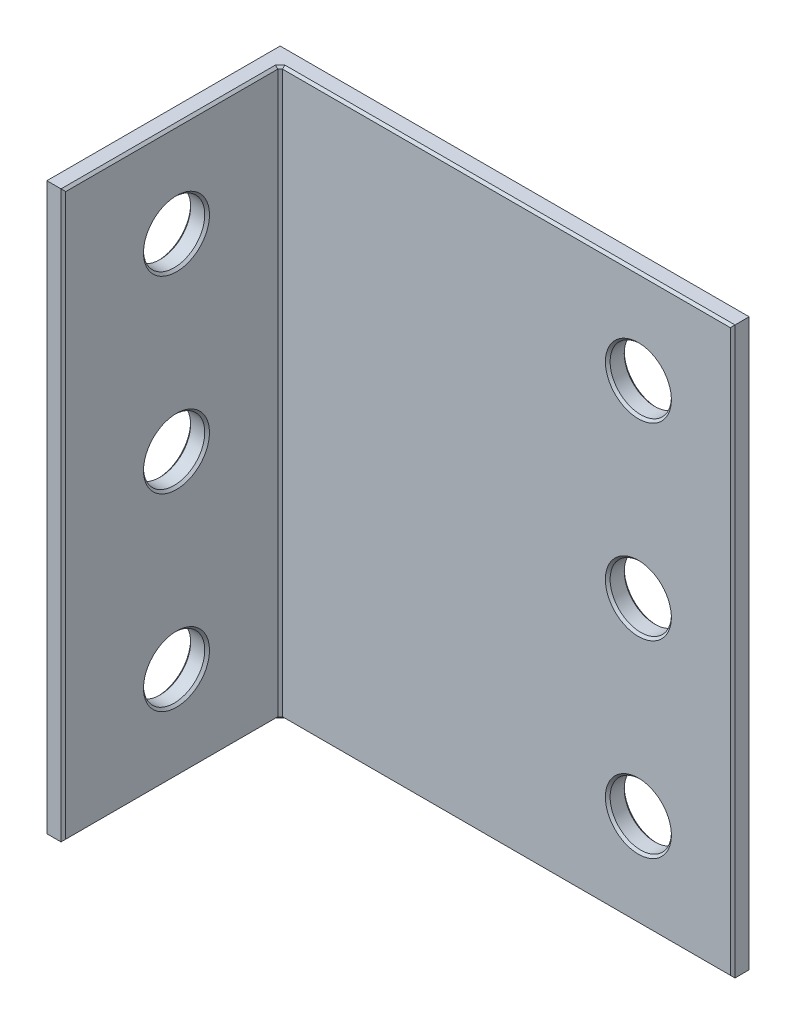
ISO-10303-21;
HEADER;
FILE_DESCRIPTION(('STEP AP214'),'2;1');
FILE_NAME('part.step','',(''),(''),'','','');
FILE_SCHEMA(('AUTOMOTIVE_DESIGN { 1 0 10303 214 1 1 1 1 }'));
ENDSEC;
DATA;
#1=APPLICATION_CONTEXT('core data for automotive mechanical design processes');
#2=APPLICATION_PROTOCOL_DEFINITION('international standard','automotive_design',2000,#1);
#3=PRODUCT_CONTEXT('',#1,'mechanical');
#4=PRODUCT('Part','Part','',(#3));
#5=PRODUCT_RELATED_PRODUCT_CATEGORY('part','',(#4));
#6=PRODUCT_DEFINITION_FORMATION('','',#4);
#7=PRODUCT_DEFINITION_CONTEXT('part definition',#1,'design');
#8=PRODUCT_DEFINITION('design','',#6,#7);
#9=PRODUCT_DEFINITION_SHAPE('','',#8);
#10=(LENGTH_UNIT() NAMED_UNIT(*) SI_UNIT(.MILLI.,.METRE.));
#11=(NAMED_UNIT(*) PLANE_ANGLE_UNIT() SI_UNIT($,.RADIAN.));
#12=(NAMED_UNIT(*) SI_UNIT($,.STERADIAN.) SOLID_ANGLE_UNIT());
#13=UNCERTAINTY_MEASURE_WITH_UNIT(LENGTH_MEASURE(1.E-05),#10,'distance_accuracy_value','');
#14=(GEOMETRIC_REPRESENTATION_CONTEXT(3) GLOBAL_UNCERTAINTY_ASSIGNED_CONTEXT((#13)) GLOBAL_UNIT_ASSIGNED_CONTEXT((#10,
#11,#12)) REPRESENTATION_CONTEXT('',''));
#15=CARTESIAN_POINT('',(0.,0.,0.));
#16=DIRECTION('',(0.,0.,1.));
#17=DIRECTION('',(1.,0.,0.));
#18=AXIS2_PLACEMENT_3D('',#15,#16,#17);
#19=CARTESIAN_POINT('',(0.,0.,8.));
#20=DIRECTION('',(0.,1.,0.));
#21=DIRECTION('',(0.,0.,1.));
#22=AXIS2_PLACEMENT_3D('',#19,#20,#21);
#23=PLANE('',#22);
#24=DIRECTION('',(0.,0.,-1.));
#25=VECTOR('',#24,1.);
#26=CARTESIAN_POINT('',(1.,0.,8.));
#27=LINE('',#26,#25);
#28=CARTESIAN_POINT('',(1.,0.,100.));
#29=VERTEX_POINT('',#28);
#30=CARTESIAN_POINT('',(1.,0.,1.));
#31=VERTEX_POINT('',#30);
#32=EDGE_CURVE('E333',#29,#31,#27,.T.);
#33=ORIENTED_EDGE('',*,*,#32,.T.);
#34=DIRECTION('',(1.,0.,0.));
#35=VECTOR('',#34,1.);
#36=CARTESIAN_POINT('',(200.,0.,1.));
#37=LINE('',#36,#35);
#38=CARTESIAN_POINT('',(200.,0.,1.));
#39=VERTEX_POINT('',#38);
#40=EDGE_CURVE('E335',#31,#39,#37,.T.);
#41=ORIENTED_EDGE('',*,*,#40,.T.);
#42=DIRECTION('',(0.,0.,-1.));
#43=VECTOR('',#42,1.);
#44=CARTESIAN_POINT('',(200.,0.,8.));
#45=LINE('',#44,#43);
#46=CARTESIAN_POINT('',(200.,0.,6.99999999999999));
#47=VERTEX_POINT('',#46);
#48=EDGE_CURVE('E346',#47,#39,#45,.T.);
#49=ORIENTED_EDGE('',*,*,#48,.F.);
#50=DIRECTION('',(-1.,0.,0.));
#51=VECTOR('',#50,1.);
#52=CARTESIAN_POINT('',(0.,0.,6.99999999999999));
#53=LINE('',#52,#51);
#54=CARTESIAN_POINT('',(9.00000000000002,0.,6.99999999999999));
#55=VERTEX_POINT('',#54);
#56=EDGE_CURVE('E331',#47,#55,#53,.T.);
#57=ORIENTED_EDGE('',*,*,#56,.T.);
#58=DIRECTION('',(0.707106781186544,0.,-0.707106781186551));
#59=VECTOR('',#58,1.);
#60=CARTESIAN_POINT('',(9.00000000000002,0.,6.99999999999999));
#61=LINE('',#60,#59);
#62=CARTESIAN_POINT('',(8.00000000000001,0.,8.));
#63=VERTEX_POINT('',#62);
#64=EDGE_CURVE('E329',#63,#55,#61,.T.);
#65=ORIENTED_EDGE('',*,*,#64,.F.);
#66=DIRECTION('',(0.707106781186544,0.,-0.707106781186551));
#67=VECTOR('',#66,1.);
#68=CARTESIAN_POINT('',(9.00000000000002,0.,6.99999999999999));
#69=LINE('',#68,#67);
#70=CARTESIAN_POINT('',(7.00000000000003,0.,9.00000000000001));
#71=VERTEX_POINT('',#70);
#72=EDGE_CURVE('E286',#71,#63,#69,.T.);
#73=ORIENTED_EDGE('',*,*,#72,.F.);
#74=DIRECTION('',(0.,0.,1.));
#75=VECTOR('',#74,1.);
#76=CARTESIAN_POINT('',(7.00000000000003,0.,8.));
#77=LINE('',#76,#75);
#78=CARTESIAN_POINT('',(7.00000000000003,0.,100.));
#79=VERTEX_POINT('',#78);
#80=EDGE_CURVE('E291',#71,#79,#77,.T.);
#81=ORIENTED_EDGE('',*,*,#80,.T.);
#82=DIRECTION('',(1.,0.,0.));
#83=VECTOR('',#82,1.);
#84=CARTESIAN_POINT('',(0.,0.,100.));
#85=LINE('',#84,#83);
#86=EDGE_CURVE('E255',#29,#79,#85,.T.);
#87=ORIENTED_EDGE('',*,*,#86,.F.);
#88=EDGE_LOOP('',(#33,#41,#49,#57,#65,#73,#81,#87));
#89=FACE_BOUND('',#88,.T.);
#90=ADVANCED_FACE('F34',(#89),#23,.F.);
#91=CARTESIAN_POINT('',(0.,240.,8.));
#92=DIRECTION('',(0.,0.,-1.));
#93=DIRECTION('',(-1.,0.,0.));
#94=AXIS2_PLACEMENT_3D('',#91,#92,#93);
#95=PLANE('',#94);
#96=CARTESIAN_POINT('',(160.,40.,8.));
#97=DIRECTION('',(0.,0.,-1.));
#98=DIRECTION('',(-1.,0.,0.));
#99=AXIS2_PLACEMENT_3D('',#96,#97,#98);
#100=CIRCLE('',#99,14.);
#101=CARTESIAN_POINT('',(146.,40.,8.));
#102=VERTEX_POINT('',#101);
#103=EDGE_CURVE('E324',#102,#102,#100,.T.);
#104=ORIENTED_EDGE('',*,*,#103,.T.);
#105=EDGE_LOOP('',(#104));
#106=FACE_BOUND('',#105,.T.);
#107=CARTESIAN_POINT('',(160.,120.,8.));
#108=DIRECTION('',(0.,0.,-1.));
#109=DIRECTION('',(-1.,0.,0.));
#110=AXIS2_PLACEMENT_3D('',#107,#108,#109);
#111=CIRCLE('',#110,14.);
#112=CARTESIAN_POINT('',(146.,120.,8.));
#113=VERTEX_POINT('',#112);
#114=EDGE_CURVE('E317',#113,#113,#111,.T.);
#115=ORIENTED_EDGE('',*,*,#114,.T.);
#116=EDGE_LOOP('',(#115));
#117=FACE_BOUND('',#116,.T.);
#118=CARTESIAN_POINT('',(160.,200.,8.));
#119=DIRECTION('',(0.,0.,-1.));
#120=DIRECTION('',(-1.,0.,0.));
#121=AXIS2_PLACEMENT_3D('',#118,#119,#120);
#122=CIRCLE('',#121,14.);
#123=CARTESIAN_POINT('',(146.,200.,8.));
#124=VERTEX_POINT('',#123);
#125=EDGE_CURVE('E314',#124,#124,#122,.T.);
#126=ORIENTED_EDGE('',*,*,#125,.T.);
#127=EDGE_LOOP('',(#126));
#128=FACE_BOUND('',#127,.T.);
#129=DIRECTION('',(0.,1.,0.));
#130=VECTOR('',#129,1.);
#131=CARTESIAN_POINT('',(199.,240.,8.));
#132=LINE('',#131,#130);
#133=CARTESIAN_POINT('',(199.,1.,8.));
#134=VERTEX_POINT('',#133);
#135=CARTESIAN_POINT('',(199.,239.,8.));
#136=VERTEX_POINT('',#135);
#137=EDGE_CURVE('E311',#134,#136,#132,.T.);
#138=ORIENTED_EDGE('',*,*,#137,.T.);
#139=DIRECTION('',(-1.,0.,0.));
#140=VECTOR('',#139,1.);
#141=CARTESIAN_POINT('',(0.,239.,8.));
#142=LINE('',#141,#140);
#143=CARTESIAN_POINT('',(9.,239.,8.));
#144=VERTEX_POINT('',#143);
#145=EDGE_CURVE('E308',#136,#144,#142,.T.);
#146=ORIENTED_EDGE('',*,*,#145,.T.);
#147=DIRECTION('',(0.,-1.,0.));
#148=VECTOR('',#147,1.);
#149=CARTESIAN_POINT('',(9.00000000000002,0.,8.));
#150=LINE('',#149,#148);
#151=CARTESIAN_POINT('',(9.00000000000002,1.,8.));
#152=VERTEX_POINT('',#151);
#153=EDGE_CURVE('E301',#144,#152,#150,.T.);
#154=ORIENTED_EDGE('',*,*,#153,.T.);
#155=DIRECTION('',(1.,0.,0.));
#156=VECTOR('',#155,1.);
#157=CARTESIAN_POINT('',(0.,1.,8.));
#158=LINE('',#157,#156);
#159=EDGE_CURVE('E304',#152,#134,#158,.T.);
#160=ORIENTED_EDGE('',*,*,#159,.T.);
#161=EDGE_LOOP('',(#138,#146,#154,#160));
#162=FACE_BOUND('',#161,.T.);
#163=ADVANCED_FACE('F309',(#106,#117,#128,#162),#95,.F.);
#164=CARTESIAN_POINT('',(0.,240.,0.));
#165=DIRECTION('',(0.,0.,-1.));
#166=DIRECTION('',(-1.,0.,0.));
#167=AXIS2_PLACEMENT_3D('',#164,#165,#166);
#168=PLANE('',#167);
#169=CARTESIAN_POINT('',(160.,200.,0.));
#170=DIRECTION('',(0.,0.,-1.));
#171=DIRECTION('',(-1.,0.,0.));
#172=AXIS2_PLACEMENT_3D('',#169,#170,#171);
#173=CIRCLE('',#172,14.);
#174=CARTESIAN_POINT('',(146.,200.,0.));
#175=VERTEX_POINT('',#174);
#176=EDGE_CURVE('E378',#175,#175,#173,.F.);
#177=ORIENTED_EDGE('',*,*,#176,.T.);
#178=EDGE_LOOP('',(#177));
#179=FACE_BOUND('',#178,.T.);
#180=CARTESIAN_POINT('',(160.,40.,0.));
#181=DIRECTION('',(0.,0.,-1.));
#182=DIRECTION('',(-1.,0.,0.));
#183=AXIS2_PLACEMENT_3D('',#180,#181,#182);
#184=CIRCLE('',#183,14.);
#185=CARTESIAN_POINT('',(146.,40.,0.));
#186=VERTEX_POINT('',#185);
#187=EDGE_CURVE('E375',#186,#186,#184,.F.);
#188=ORIENTED_EDGE('',*,*,#187,.T.);
#189=EDGE_LOOP('',(#188));
#190=FACE_BOUND('',#189,.T.);
#191=CARTESIAN_POINT('',(160.,120.,0.));
#192=DIRECTION('',(0.,0.,-1.));
#193=DIRECTION('',(-1.,0.,0.));
#194=AXIS2_PLACEMENT_3D('',#191,#192,#193);
#195=CIRCLE('',#194,14.);
#196=CARTESIAN_POINT('',(146.,120.,0.));
#197=VERTEX_POINT('',#196);
#198=EDGE_CURVE('E367',#197,#197,#195,.F.);
#199=ORIENTED_EDGE('',*,*,#198,.T.);
#200=EDGE_LOOP('',(#199));
#201=FACE_BOUND('',#200,.T.);
#202=DIRECTION('',(0.,-1.,0.));
#203=VECTOR('',#202,1.);
#204=CARTESIAN_POINT('',(199.,0.,0.));
#205=LINE('',#204,#203);
#206=CARTESIAN_POINT('',(199.,239.,0.));
#207=VERTEX_POINT('',#206);
#208=CARTESIAN_POINT('',(199.,1.,0.));
#209=VERTEX_POINT('',#208);
#210=EDGE_CURVE('E360',#207,#209,#205,.T.);
#211=ORIENTED_EDGE('',*,*,#210,.T.);
#212=DIRECTION('',(-1.,0.,0.));
#213=VECTOR('',#212,1.);
#214=CARTESIAN_POINT('',(0.,1.,0.));
#215=LINE('',#214,#213);
#216=CARTESIAN_POINT('',(1.,1.,0.));
#217=VERTEX_POINT('',#216);
#218=EDGE_CURVE('E364',#209,#217,#215,.T.);
#219=ORIENTED_EDGE('',*,*,#218,.T.);
#220=DIRECTION('',(0.,1.,0.));
#221=VECTOR('',#220,1.);
#222=CARTESIAN_POINT('',(1.,240.,0.));
#223=LINE('',#222,#221);
#224=CARTESIAN_POINT('',(1.,239.,0.));
#225=VERTEX_POINT('',#224);
#226=EDGE_CURVE('E369',#217,#225,#223,.T.);
#227=ORIENTED_EDGE('',*,*,#226,.T.);
#228=DIRECTION('',(1.,0.,0.));
#229=VECTOR('',#228,1.);
#230=CARTESIAN_POINT('',(200.,239.,0.));
#231=LINE('',#230,#229);
#232=EDGE_CURVE('E365',#225,#207,#231,.T.);
#233=ORIENTED_EDGE('',*,*,#232,.T.);
#234=EDGE_LOOP('',(#211,#219,#227,#233));
#235=FACE_BOUND('',#234,.T.);
#236=ADVANCED_FACE('F424',(#179,#190,#201,#235),#168,.T.);
#237=CARTESIAN_POINT('',(0.,0.,8.));
#238=DIRECTION('',(1.,0.,0.));
#239=DIRECTION('',(0.,0.,-1.));
#240=AXIS2_PLACEMENT_3D('',#237,#238,#239);
#241=PLANE('',#240);
#242=DIRECTION('',(0.,1.,0.));
#243=VECTOR('',#242,1.);
#244=CARTESIAN_POINT('',(0.,240.,99.));
#245=LINE('',#244,#243);
#246=CARTESIAN_POINT('',(0.,1.,99.));
#247=VERTEX_POINT('',#246);
#248=CARTESIAN_POINT('',(0.,239.,99.));
#249=VERTEX_POINT('',#248);
#250=EDGE_CURVE('E187',#247,#249,#245,.T.);
#251=ORIENTED_EDGE('',*,*,#250,.T.);
#252=DIRECTION('',(0.,0.,-1.));
#253=VECTOR('',#252,1.);
#254=CARTESIAN_POINT('',(0.,239.,8.));
#255=LINE('',#254,#253);
#256=CARTESIAN_POINT('',(0.,239.,1.));
#257=VERTEX_POINT('',#256);
#258=EDGE_CURVE('E189',#249,#257,#255,.T.);
#259=ORIENTED_EDGE('',*,*,#258,.T.);
#260=DIRECTION('',(0.,-1.,0.));
#261=VECTOR('',#260,1.);
#262=CARTESIAN_POINT('',(0.,0.,1.));
#263=LINE('',#262,#261);
#264=CARTESIAN_POINT('',(0.,1.,1.));
#265=VERTEX_POINT('',#264);
#266=EDGE_CURVE('E183',#257,#265,#263,.T.);
#267=ORIENTED_EDGE('',*,*,#266,.T.);
#268=DIRECTION('',(0.,0.,1.));
#269=VECTOR('',#268,1.);
#270=CARTESIAN_POINT('',(0.,1.,8.));
#271=LINE('',#270,#269);
#272=EDGE_CURVE('E185',#265,#247,#271,.T.);
#273=ORIENTED_EDGE('',*,*,#272,.T.);
#274=EDGE_LOOP('',(#251,#259,#267,#273));
#275=FACE_BOUND('',#274,.T.);
#276=CARTESIAN_POINT('',(0.,200.,52.));
#277=DIRECTION('',(1.,0.,0.));
#278=DIRECTION('',(0.,0.,-1.));
#279=AXIS2_PLACEMENT_3D('',#276,#277,#278);
#280=CIRCLE('',#279,14.);
#281=CARTESIAN_POINT('',(0.,200.,38.));
#282=VERTEX_POINT('',#281);
#283=EDGE_CURVE('E180',#282,#282,#280,.T.);
#284=ORIENTED_EDGE('',*,*,#283,.T.);
#285=EDGE_LOOP('',(#284));
#286=FACE_BOUND('',#285,.T.);
#287=CARTESIAN_POINT('',(0.,40.,52.));
#288=DIRECTION('',(1.,0.,0.));
#289=DIRECTION('',(0.,0.,-1.));
#290=AXIS2_PLACEMENT_3D('',#287,#288,#289);
#291=CIRCLE('',#290,14.);
#292=CARTESIAN_POINT('',(0.,40.,38.));
#293=VERTEX_POINT('',#292);
#294=EDGE_CURVE('E177',#293,#293,#291,.T.);
#295=ORIENTED_EDGE('',*,*,#294,.T.);
#296=EDGE_LOOP('',(#295));
#297=FACE_BOUND('',#296,.T.);
#298=CARTESIAN_POINT('',(0.,120.,52.));
#299=DIRECTION('',(1.,0.,0.));
#300=DIRECTION('',(0.,0.,-1.));
#301=AXIS2_PLACEMENT_3D('',#298,#299,#300);
#302=CIRCLE('',#301,14.);
#303=CARTESIAN_POINT('',(0.,120.,38.));
#304=VERTEX_POINT('',#303);
#305=EDGE_CURVE('E174',#304,#304,#302,.T.);
#306=ORIENTED_EDGE('',*,*,#305,.T.);
#307=EDGE_LOOP('',(#306));
#308=FACE_BOUND('',#307,.T.);
#309=ADVANCED_FACE('F430',(#275,#286,#297,#308),#241,.F.);
#310=CARTESIAN_POINT('',(200.,0.,8.));
#311=DIRECTION('',(-1.,0.,0.));
#312=DIRECTION('',(0.,0.,1.));
#313=AXIS2_PLACEMENT_3D('',#310,#311,#312);
#314=PLANE('',#313);
#315=ORIENTED_EDGE('',*,*,#48,.T.);
#316=DIRECTION('',(0.,1.,0.));
#317=VECTOR('',#316,1.);
#318=CARTESIAN_POINT('',(200.,240.,1.));
#319=LINE('',#318,#317);
#320=CARTESIAN_POINT('',(200.,240.,1.));
#321=VERTEX_POINT('',#320);
#322=EDGE_CURVE('E158',#39,#321,#319,.T.);
#323=ORIENTED_EDGE('',*,*,#322,.T.);
#324=DIRECTION('',(0.,0.,-1.));
#325=VECTOR('',#324,1.);
#326=CARTESIAN_POINT('',(200.,240.,8.));
#327=LINE('',#326,#325);
#328=CARTESIAN_POINT('',(200.,240.,6.99999999999999));
#329=VERTEX_POINT('',#328);
#330=EDGE_CURVE('E344',#329,#321,#327,.T.);
#331=ORIENTED_EDGE('',*,*,#330,.F.);
#332=DIRECTION('',(0.,-1.,0.));
#333=VECTOR('',#332,1.);
#334=CARTESIAN_POINT('',(200.,0.,6.99999999999999));
#335=LINE('',#334,#333);
#336=EDGE_CURVE('E338',#329,#47,#335,.T.);
#337=ORIENTED_EDGE('',*,*,#336,.T.);
#338=EDGE_LOOP('',(#315,#323,#331,#337));
#339=FACE_BOUND('',#338,.T.);
#340=ADVANCED_FACE('F343',(#339),#314,.F.);
#341=CARTESIAN_POINT('',(0.,240.,8.));
#342=DIRECTION('',(0.,-1.,0.));
#343=DIRECTION('',(0.,0.,-1.));
#344=AXIS2_PLACEMENT_3D('',#341,#342,#343);
#345=PLANE('',#344);
#346=ORIENTED_EDGE('',*,*,#330,.T.);
#347=DIRECTION('',(-1.,0.,0.));
#348=VECTOR('',#347,1.);
#349=CARTESIAN_POINT('',(0.,240.,1.));
#350=LINE('',#349,#348);
#351=CARTESIAN_POINT('',(1.,240.,1.));
#352=VERTEX_POINT('',#351);
#353=EDGE_CURVE('E172',#321,#352,#350,.T.);
#354=ORIENTED_EDGE('',*,*,#353,.T.);
#355=DIRECTION('',(0.,0.,1.));
#356=VECTOR('',#355,1.);
#357=CARTESIAN_POINT('',(1.,240.,8.));
#358=LINE('',#357,#356);
#359=CARTESIAN_POINT('',(1.,240.,100.));
#360=VERTEX_POINT('',#359);
#361=EDGE_CURVE('E170',#352,#360,#358,.T.);
#362=ORIENTED_EDGE('',*,*,#361,.T.);
#363=DIRECTION('',(-1.,0.,0.));
#364=VECTOR('',#363,1.);
#365=CARTESIAN_POINT('',(0.,240.,100.));
#366=LINE('',#365,#364);
#367=CARTESIAN_POINT('',(7.,240.,100.));
#368=VERTEX_POINT('',#367);
#369=EDGE_CURVE('E351',#368,#360,#366,.T.);
#370=ORIENTED_EDGE('',*,*,#369,.F.);
#371=DIRECTION('',(0.,0.,-1.));
#372=VECTOR('',#371,1.);
#373=CARTESIAN_POINT('',(7.,240.,8.));
#374=LINE('',#373,#372);
#375=CARTESIAN_POINT('',(7.,240.,9.00000000000001));
#376=VERTEX_POINT('',#375);
#377=EDGE_CURVE('E154',#368,#376,#374,.T.);
#378=ORIENTED_EDGE('',*,*,#377,.T.);
#379=DIRECTION('',(-0.707106781186544,0.,0.707106781186551));
#380=VECTOR('',#379,1.);
#381=CARTESIAN_POINT('',(7.,240.,9.00000000000001));
#382=LINE('',#381,#380);
#383=CARTESIAN_POINT('',(8.,240.,8.));
#384=VERTEX_POINT('',#383);
#385=EDGE_CURVE('E145',#384,#376,#382,.T.);
#386=ORIENTED_EDGE('',*,*,#385,.F.);
#387=DIRECTION('',(-0.707106781186544,0.,0.707106781186551));
#388=VECTOR('',#387,1.);
#389=CARTESIAN_POINT('',(7.,240.,9.00000000000001));
#390=LINE('',#389,#388);
#391=CARTESIAN_POINT('',(9.,240.,6.99999999999999));
#392=VERTEX_POINT('',#391);
#393=EDGE_CURVE('E150',#392,#384,#390,.T.);
#394=ORIENTED_EDGE('',*,*,#393,.F.);
#395=DIRECTION('',(1.,0.,0.));
#396=VECTOR('',#395,1.);
#397=CARTESIAN_POINT('',(0.,240.,6.99999999999999));
#398=LINE('',#397,#396);
#399=EDGE_CURVE('E165',#392,#329,#398,.T.);
#400=ORIENTED_EDGE('',*,*,#399,.T.);
#401=EDGE_LOOP('',(#346,#354,#362,#370,#378,#386,#394,#400));
#402=FACE_BOUND('',#401,.T.);
#403=ADVANCED_FACE('F148',(#402),#345,.F.);
#404=CARTESIAN_POINT('',(160.,40.,8.));
#405=DIRECTION('',(0.,0.,-1.));
#406=DIRECTION('',(-1.,0.,0.));
#407=AXIS2_PLACEMENT_3D('',#404,#405,#406);
#408=CYLINDRICAL_SURFACE('',#407,13.);
#409=CARTESIAN_POINT('',(160.,40.,1.00000000000001));
#410=DIRECTION('',(0.,0.,-1.));
#411=DIRECTION('',(-1.,0.,0.));
#412=AXIS2_PLACEMENT_3D('',#409,#410,#411);
#413=CIRCLE('',#412,13.);
#414=CARTESIAN_POINT('',(147.,40.,1.00000000000001));
#415=VERTEX_POINT('',#414);
#416=EDGE_CURVE('E390',#415,#415,#413,.T.);
#417=ORIENTED_EDGE('',*,*,#416,.T.);
#418=EDGE_LOOP('',(#417));
#419=FACE_BOUND('',#418,.T.);
#420=CARTESIAN_POINT('',(160.,40.,6.99999999999999));
#421=DIRECTION('',(0.,0.,-1.));
#422=DIRECTION('',(-1.,0.,0.));
#423=AXIS2_PLACEMENT_3D('',#420,#421,#422);
#424=CIRCLE('',#423,13.);
#425=CARTESIAN_POINT('',(147.,40.,6.99999999999999));
#426=VERTEX_POINT('',#425);
#427=EDGE_CURVE('E387',#426,#426,#424,.F.);
#428=ORIENTED_EDGE('',*,*,#427,.T.);
#429=EDGE_LOOP('',(#428));
#430=FACE_BOUND('',#429,.T.);
#431=ADVANCED_FACE('F537',(#419,#430),#408,.F.);
#432=CARTESIAN_POINT('',(160.,120.,8.));
#433=DIRECTION('',(0.,0.,-1.));
#434=DIRECTION('',(-1.,0.,0.));
#435=AXIS2_PLACEMENT_3D('',#432,#433,#434);
#436=CYLINDRICAL_SURFACE('',#435,13.);
#437=CARTESIAN_POINT('',(160.,120.,1.00000000000001));
#438=DIRECTION('',(0.,0.,-1.));
#439=DIRECTION('',(-1.,0.,0.));
#440=AXIS2_PLACEMENT_3D('',#437,#438,#439);
#441=CIRCLE('',#440,13.);
#442=CARTESIAN_POINT('',(147.,120.,1.00000000000001));
#443=VERTEX_POINT('',#442);
#444=EDGE_CURVE('E305',#443,#443,#441,.T.);
#445=ORIENTED_EDGE('',*,*,#444,.T.);
#446=EDGE_LOOP('',(#445));
#447=FACE_BOUND('',#446,.T.);
#448=CARTESIAN_POINT('',(160.,120.,6.99999999999999));
#449=DIRECTION('',(0.,0.,-1.));
#450=DIRECTION('',(-1.,0.,0.));
#451=AXIS2_PLACEMENT_3D('',#448,#449,#450);
#452=CIRCLE('',#451,13.);
#453=CARTESIAN_POINT('',(147.,120.,6.99999999999999));
#454=VERTEX_POINT('',#453);
#455=EDGE_CURVE('E393',#454,#454,#452,.F.);
#456=ORIENTED_EDGE('',*,*,#455,.T.);
#457=EDGE_LOOP('',(#456));
#458=FACE_BOUND('',#457,.T.);
#459=ADVANCED_FACE('F530',(#447,#458),#436,.F.);
#460=CARTESIAN_POINT('',(160.,200.,8.));
#461=DIRECTION('',(0.,0.,-1.));
#462=DIRECTION('',(-1.,0.,0.));
#463=AXIS2_PLACEMENT_3D('',#460,#461,#462);
#464=CYLINDRICAL_SURFACE('',#463,13.);
#465=CARTESIAN_POINT('',(160.,200.,1.));
#466=DIRECTION('',(0.,0.,-1.));
#467=DIRECTION('',(-1.,0.,0.));
#468=AXIS2_PLACEMENT_3D('',#465,#466,#467);
#469=CIRCLE('',#468,13.);
#470=CARTESIAN_POINT('',(147.,200.,1.));
#471=VERTEX_POINT('',#470);
#472=EDGE_CURVE('E384',#471,#471,#469,.T.);
#473=ORIENTED_EDGE('',*,*,#472,.T.);
#474=EDGE_LOOP('',(#473));
#475=FACE_BOUND('',#474,.T.);
#476=CARTESIAN_POINT('',(160.,200.,6.99999999999999));
#477=DIRECTION('',(0.,0.,-1.));
#478=DIRECTION('',(-1.,0.,0.));
#479=AXIS2_PLACEMENT_3D('',#476,#477,#478);
#480=CIRCLE('',#479,13.);
#481=CARTESIAN_POINT('',(147.,200.,6.99999999999999));
#482=VERTEX_POINT('',#481);
#483=EDGE_CURVE('E381',#482,#482,#480,.F.);
#484=ORIENTED_EDGE('',*,*,#483,.T.);
#485=EDGE_LOOP('',(#484));
#486=FACE_BOUND('',#485,.T.);
#487=ADVANCED_FACE('F521',(#475,#486),#464,.F.);
#488=CARTESIAN_POINT('',(8.,240.,100.));
#489=DIRECTION('',(-1.,0.,0.));
#490=DIRECTION('',(0.,-1.,0.));
#491=AXIS2_PLACEMENT_3D('',#488,#489,#490);
#492=PLANE('',#491);
#493=DIRECTION('',(0.,-1.,0.));
#494=VECTOR('',#493,1.);
#495=CARTESIAN_POINT('',(8.00000000000003,0.,99.));
#496=LINE('',#495,#494);
#497=CARTESIAN_POINT('',(8.,239.,99.));
#498=VERTEX_POINT('',#497);
#499=CARTESIAN_POINT('',(8.00000000000003,1.,99.));
#500=VERTEX_POINT('',#499);
#501=EDGE_CURVE('E43',#498,#500,#496,.T.);
#502=ORIENTED_EDGE('',*,*,#501,.T.);
#503=DIRECTION('',(0.,0.,-1.));
#504=VECTOR('',#503,1.);
#505=CARTESIAN_POINT('',(8.00000000000003,1.,100.));
#506=LINE('',#505,#504);
#507=CARTESIAN_POINT('',(8.00000000000003,1.,9.00000000000001));
#508=VERTEX_POINT('',#507);
#509=EDGE_CURVE('E11',#500,#508,#506,.T.);
#510=ORIENTED_EDGE('',*,*,#509,.T.);
#511=DIRECTION('',(0.,1.,0.));
#512=VECTOR('',#511,1.);
#513=CARTESIAN_POINT('',(8.,240.,9.00000000000001));
#514=LINE('',#513,#512);
#515=CARTESIAN_POINT('',(8.,239.,9.00000000000001));
#516=VERTEX_POINT('',#515);
#517=EDGE_CURVE('E223',#508,#516,#514,.T.);
#518=ORIENTED_EDGE('',*,*,#517,.T.);
#519=DIRECTION('',(0.,0.,1.));
#520=VECTOR('',#519,1.);
#521=CARTESIAN_POINT('',(8.,239.,100.));
#522=LINE('',#521,#520);
#523=EDGE_CURVE('E54',#516,#498,#522,.T.);
#524=ORIENTED_EDGE('',*,*,#523,.T.);
#525=EDGE_LOOP('',(#502,#510,#518,#524));
#526=FACE_BOUND('',#525,.T.);
#527=CARTESIAN_POINT('',(8.00000000000001,200.,52.));
#528=DIRECTION('',(-1.,0.,0.));
#529=DIRECTION('',(0.,-1.,0.));
#530=AXIS2_PLACEMENT_3D('',#527,#528,#529);
#531=CIRCLE('',#530,14.);
#532=CARTESIAN_POINT('',(8.00000000000001,186.,52.));
#533=VERTEX_POINT('',#532);
#534=EDGE_CURVE('E220',#533,#533,#531,.T.);
#535=ORIENTED_EDGE('',*,*,#534,.T.);
#536=EDGE_LOOP('',(#535));
#537=FACE_BOUND('',#536,.T.);
#538=CARTESIAN_POINT('',(8.00000000000002,40.,52.));
#539=DIRECTION('',(-1.,0.,0.));
#540=DIRECTION('',(0.,-1.,0.));
#541=AXIS2_PLACEMENT_3D('',#538,#539,#540);
#542=CIRCLE('',#541,14.);
#543=CARTESIAN_POINT('',(8.00000000000002,26.,52.));
#544=VERTEX_POINT('',#543);
#545=EDGE_CURVE('E217',#544,#544,#542,.T.);
#546=ORIENTED_EDGE('',*,*,#545,.T.);
#547=EDGE_LOOP('',(#546));
#548=FACE_BOUND('',#547,.T.);
#549=CARTESIAN_POINT('',(8.00000000000001,120.,52.));
#550=DIRECTION('',(-1.,0.,0.));
#551=DIRECTION('',(0.,-1.,0.));
#552=AXIS2_PLACEMENT_3D('',#549,#550,#551);
#553=CIRCLE('',#552,14.);
#554=CARTESIAN_POINT('',(8.00000000000002,106.,52.));
#555=VERTEX_POINT('',#554);
#556=EDGE_CURVE('E214',#555,#555,#553,.T.);
#557=ORIENTED_EDGE('',*,*,#556,.T.);
#558=EDGE_LOOP('',(#557));
#559=FACE_BOUND('',#558,.T.);
#560=ADVANCED_FACE('F292',(#526,#537,#548,#559),#492,.F.);
#561=CARTESIAN_POINT('',(0.,0.,100.));
#562=DIRECTION('',(0.,0.,1.));
#563=DIRECTION('',(1.,0.,0.));
#564=AXIS2_PLACEMENT_3D('',#561,#562,#563);
#565=PLANE('',#564);
#566=ORIENTED_EDGE('',*,*,#369,.T.);
#567=DIRECTION('',(0.,-1.,0.));
#568=VECTOR('',#567,1.);
#569=CARTESIAN_POINT('',(1.,0.,100.));
#570=LINE('',#569,#568);
#571=EDGE_CURVE('E194',#360,#29,#570,.T.);
#572=ORIENTED_EDGE('',*,*,#571,.T.);
#573=ORIENTED_EDGE('',*,*,#86,.T.);
#574=DIRECTION('',(0.,1.,0.));
#575=VECTOR('',#574,1.);
#576=CARTESIAN_POINT('',(7.,240.,100.));
#577=LINE('',#576,#575);
#578=EDGE_CURVE('E192',#79,#368,#577,.T.);
#579=ORIENTED_EDGE('',*,*,#578,.T.);
#580=EDGE_LOOP('',(#566,#572,#573,#579));
#581=FACE_BOUND('',#580,.T.);
#582=ADVANCED_FACE('F520',(#581),#565,.T.);
#583=CARTESIAN_POINT('',(200.,200.,52.));
#584=DIRECTION('',(-1.,0.,0.));
#585=DIRECTION('',(0.,0.,1.));
#586=AXIS2_PLACEMENT_3D('',#583,#584,#585);
#587=CYLINDRICAL_SURFACE('',#586,13.);
#588=CARTESIAN_POINT('',(1.,200.,52.));
#589=DIRECTION('',(1.,0.,0.));
#590=DIRECTION('',(0.,0.,-1.));
#591=AXIS2_PLACEMENT_3D('',#588,#589,#590);
#592=CIRCLE('',#591,13.);
#593=CARTESIAN_POINT('',(1.,200.,39.));
#594=VERTEX_POINT('',#593);
#595=EDGE_CURVE('E199',#594,#594,#592,.F.);
#596=ORIENTED_EDGE('',*,*,#595,.T.);
#597=EDGE_LOOP('',(#596));
#598=FACE_BOUND('',#597,.T.);
#599=CARTESIAN_POINT('',(7.00000000000001,200.,52.));
#600=DIRECTION('',(-1.,0.,0.));
#601=DIRECTION('',(0.,0.,1.));
#602=AXIS2_PLACEMENT_3D('',#599,#600,#601);
#603=CIRCLE('',#602,13.);
#604=CARTESIAN_POINT('',(7.00000000000001,200.,65.));
#605=VERTEX_POINT('',#604);
#606=EDGE_CURVE('E196',#605,#605,#603,.F.);
#607=ORIENTED_EDGE('',*,*,#606,.T.);
#608=EDGE_LOOP('',(#607));
#609=FACE_BOUND('',#608,.T.);
#610=ADVANCED_FACE('F527',(#598,#609),#587,.F.);
#611=CARTESIAN_POINT('',(200.,40.,52.));
#612=DIRECTION('',(-1.,0.,0.));
#613=DIRECTION('',(0.,0.,1.));
#614=AXIS2_PLACEMENT_3D('',#611,#612,#613);
#615=CYLINDRICAL_SURFACE('',#614,13.);
#616=CARTESIAN_POINT('',(1.,40.,52.));
#617=DIRECTION('',(1.,0.,0.));
#618=DIRECTION('',(0.,0.,-1.));
#619=AXIS2_PLACEMENT_3D('',#616,#617,#618);
#620=CIRCLE('',#619,13.);
#621=CARTESIAN_POINT('',(1.,40.,39.));
#622=VERTEX_POINT('',#621);
#623=EDGE_CURVE('E205',#622,#622,#620,.F.);
#624=ORIENTED_EDGE('',*,*,#623,.T.);
#625=EDGE_LOOP('',(#624));
#626=FACE_BOUND('',#625,.T.);
#627=CARTESIAN_POINT('',(7.00000000000001,40.,52.));
#628=DIRECTION('',(-1.,0.,0.));
#629=DIRECTION('',(0.,0.,1.));
#630=AXIS2_PLACEMENT_3D('',#627,#628,#629);
#631=CIRCLE('',#630,13.);
#632=CARTESIAN_POINT('',(7.00000000000001,40.,65.));
#633=VERTEX_POINT('',#632);
#634=EDGE_CURVE('E202',#633,#633,#631,.F.);
#635=ORIENTED_EDGE('',*,*,#634,.T.);
#636=EDGE_LOOP('',(#635));
#637=FACE_BOUND('',#636,.T.);
#638=ADVANCED_FACE('F511',(#626,#637),#615,.F.);
#639=CARTESIAN_POINT('',(200.,120.,52.));
#640=DIRECTION('',(-1.,0.,0.));
#641=DIRECTION('',(0.,0.,1.));
#642=AXIS2_PLACEMENT_3D('',#639,#640,#641);
#643=CYLINDRICAL_SURFACE('',#642,13.);
#644=CARTESIAN_POINT('',(1.,120.,52.));
#645=DIRECTION('',(1.,0.,0.));
#646=DIRECTION('',(0.,0.,-1.));
#647=AXIS2_PLACEMENT_3D('',#644,#645,#646);
#648=CIRCLE('',#647,13.);
#649=CARTESIAN_POINT('',(1.,120.,39.));
#650=VERTEX_POINT('',#649);
#651=EDGE_CURVE('E211',#650,#650,#648,.F.);
#652=ORIENTED_EDGE('',*,*,#651,.T.);
#653=EDGE_LOOP('',(#652));
#654=FACE_BOUND('',#653,.T.);
#655=CARTESIAN_POINT('',(7.00000000000003,120.,52.));
#656=DIRECTION('',(-1.,0.,0.));
#657=DIRECTION('',(0.,0.,1.));
#658=AXIS2_PLACEMENT_3D('',#655,#656,#657);
#659=CIRCLE('',#658,13.);
#660=CARTESIAN_POINT('',(7.00000000000003,120.,65.));
#661=VERTEX_POINT('',#660);
#662=EDGE_CURVE('E208',#661,#661,#659,.F.);
#663=ORIENTED_EDGE('',*,*,#662,.T.);
#664=EDGE_LOOP('',(#663));
#665=FACE_BOUND('',#664,.T.);
#666=ADVANCED_FACE('F438',(#654,#665),#643,.F.);
#667=CARTESIAN_POINT('',(160.,200.,0.));
#668=DIRECTION('',(0.,0.,-1.));
#669=DIRECTION('',(-1.,0.,0.));
#670=AXIS2_PLACEMENT_3D('',#667,#668,#669);
#671=CONICAL_SURFACE('',#670,14.,0.78539816339745);
#672=ORIENTED_EDGE('',*,*,#472,.F.);
#673=EDGE_LOOP('',(#672));
#674=FACE_BOUND('',#673,.T.);
#675=ORIENTED_EDGE('',*,*,#176,.F.);
#676=EDGE_LOOP('',(#675));
#677=FACE_BOUND('',#676,.T.);
#678=ADVANCED_FACE('F434',(#674,#677),#671,.F.);
#679=CARTESIAN_POINT('',(160.,40.,0.));
#680=DIRECTION('',(0.,0.,-1.));
#681=DIRECTION('',(-1.,0.,0.));
#682=AXIS2_PLACEMENT_3D('',#679,#680,#681);
#683=CONICAL_SURFACE('',#682,14.,0.785398163397448);
#684=ORIENTED_EDGE('',*,*,#416,.F.);
#685=EDGE_LOOP('',(#684));
#686=FACE_BOUND('',#685,.T.);
#687=ORIENTED_EDGE('',*,*,#187,.F.);
#688=EDGE_LOOP('',(#687));
#689=FACE_BOUND('',#688,.T.);
#690=ADVANCED_FACE('F437',(#686,#689),#683,.F.);
#691=CARTESIAN_POINT('',(160.,120.,0.));
#692=DIRECTION('',(0.,0.,-1.));
#693=DIRECTION('',(-1.,0.,0.));
#694=AXIS2_PLACEMENT_3D('',#691,#692,#693);
#695=CONICAL_SURFACE('',#694,14.,0.785398163397448);
#696=ORIENTED_EDGE('',*,*,#444,.F.);
#697=EDGE_LOOP('',(#696));
#698=FACE_BOUND('',#697,.T.);
#699=ORIENTED_EDGE('',*,*,#198,.F.);
#700=EDGE_LOOP('',(#699));
#701=FACE_BOUND('',#700,.T.);
#702=ADVANCED_FACE('F442',(#698,#701),#695,.F.);
#703=CARTESIAN_POINT('',(160.,40.,6.99999999999999));
#704=DIRECTION('',(0.,0.,1.));
#705=DIRECTION('',(1.,0.,0.));
#706=AXIS2_PLACEMENT_3D('',#703,#704,#705);
#707=CONICAL_SURFACE('',#706,13.,0.785398163397447);
#708=ORIENTED_EDGE('',*,*,#103,.F.);
#709=EDGE_LOOP('',(#708));
#710=FACE_BOUND('',#709,.T.);
#711=ORIENTED_EDGE('',*,*,#427,.F.);
#712=EDGE_LOOP('',(#711));
#713=FACE_BOUND('',#712,.T.);
#714=ADVANCED_FACE('F446',(#710,#713),#707,.F.);
#715=CARTESIAN_POINT('',(160.,120.,6.99999999999999));
#716=DIRECTION('',(0.,0.,1.));
#717=DIRECTION('',(1.,0.,0.));
#718=AXIS2_PLACEMENT_3D('',#715,#716,#717);
#719=CONICAL_SURFACE('',#718,13.,0.785398163397447);
#720=ORIENTED_EDGE('',*,*,#114,.F.);
#721=EDGE_LOOP('',(#720));
#722=FACE_BOUND('',#721,.T.);
#723=ORIENTED_EDGE('',*,*,#455,.F.);
#724=EDGE_LOOP('',(#723));
#725=FACE_BOUND('',#724,.T.);
#726=ADVANCED_FACE('F450',(#722,#725),#719,.F.);
#727=CARTESIAN_POINT('',(160.,200.,6.99999999999999));
#728=DIRECTION('',(0.,0.,1.));
#729=DIRECTION('',(1.,0.,0.));
#730=AXIS2_PLACEMENT_3D('',#727,#728,#729);
#731=CONICAL_SURFACE('',#730,13.,0.785398163397447);
#732=ORIENTED_EDGE('',*,*,#125,.F.);
#733=EDGE_LOOP('',(#732));
#734=FACE_BOUND('',#733,.T.);
#735=ORIENTED_EDGE('',*,*,#483,.F.);
#736=EDGE_LOOP('',(#735));
#737=FACE_BOUND('',#736,.T.);
#738=ADVANCED_FACE('F454',(#734,#737),#731,.F.);
#739=CARTESIAN_POINT('',(0.,239.,8.));
#740=DIRECTION('',(0.707106781186547,-0.707106781186549,0.));
#741=DIRECTION('',(0.707106781186549,0.707106781186547,0.));
#742=AXIS2_PLACEMENT_3D('',#739,#740,#741);
#743=PLANE('',#742);
#744=DIRECTION('',(-0.707106781186548,-0.707106781186547,0.));
#745=VECTOR('',#744,1.);
#746=CARTESIAN_POINT('',(1.,240.,1.));
#747=LINE('',#746,#745);
#748=EDGE_CURVE('E249',#257,#352,#747,.F.);
#749=ORIENTED_EDGE('',*,*,#748,.F.);
#750=ORIENTED_EDGE('',*,*,#258,.F.);
#751=DIRECTION('',(0.577350269189627,0.577350269189625,0.577350269189625));
#752=VECTOR('',#751,1.);
#753=CARTESIAN_POINT('',(-79.0000000000001,160.,20.0000000000002));
#754=LINE('',#753,#752);
#755=EDGE_CURVE('E252',#360,#249,#754,.F.);
#756=ORIENTED_EDGE('',*,*,#755,.F.);
#757=ORIENTED_EDGE('',*,*,#361,.F.);
#758=EDGE_LOOP('',(#749,#750,#756,#757));
#759=FACE_BOUND('',#758,.T.);
#760=ADVANCED_FACE('F458',(#759),#743,.F.);
#761=CARTESIAN_POINT('',(1.,0.,100.));
#762=DIRECTION('',(-0.707106781186547,0.,0.707106781186549));
#763=DIRECTION('',(0.707106781186549,0.,0.707106781186547));
#764=AXIS2_PLACEMENT_3D('',#761,#762,#763);
#765=PLANE('',#764);
#766=ORIENTED_EDGE('',*,*,#755,.T.);
#767=ORIENTED_EDGE('',*,*,#250,.F.);
#768=DIRECTION('',(0.577350269189627,-0.577350269189625,0.577350269189625));
#769=VECTOR('',#768,1.);
#770=CARTESIAN_POINT('',(-29.6666666666667,30.6666666666666,69.3333333333334));
#771=LINE('',#770,#769);
#772=EDGE_CURVE('E243',#29,#247,#771,.F.);
#773=ORIENTED_EDGE('',*,*,#772,.F.);
#774=ORIENTED_EDGE('',*,*,#571,.F.);
#775=EDGE_LOOP('',(#766,#767,#773,#774));
#776=FACE_BOUND('',#775,.T.);
#777=ADVANCED_FACE('F484',(#776),#765,.T.);
#778=CARTESIAN_POINT('',(1.,240.,1.));
#779=DIRECTION('',(-0.577350269189625,0.577350269189626,-0.577350269189627));
#780=DIRECTION('',(0.,0.707106781186548,0.707106781186547));
#781=AXIS2_PLACEMENT_3D('',#778,#779,#780);
#782=PLANE('',#781);
#783=DIRECTION('',(0.,-0.707106781186548,-0.707106781186547));
#784=VECTOR('',#783,1.);
#785=CARTESIAN_POINT('',(1.,240.,1.));
#786=LINE('',#785,#784);
#787=EDGE_CURVE('E240',#225,#352,#786,.F.);
#788=ORIENTED_EDGE('',*,*,#787,.F.);
#789=DIRECTION('',(-0.707106781186549,0.,0.707106781186546));
#790=VECTOR('',#789,1.);
#791=CARTESIAN_POINT('',(0.500000000000003,239.,0.499999999999998));
#792=LINE('',#791,#790);
#793=EDGE_CURVE('E246',#257,#225,#792,.F.);
#794=ORIENTED_EDGE('',*,*,#793,.F.);
#795=ORIENTED_EDGE('',*,*,#748,.T.);
#796=EDGE_LOOP('',(#788,#794,#795));
#797=FACE_BOUND('',#796,.T.);
#798=ADVANCED_FACE('F480',(#797),#782,.T.);
#799=CARTESIAN_POINT('',(0.,0.,1.));
#800=DIRECTION('',(-0.707106781186546,0.,-0.707106781186549));
#801=DIRECTION('',(-0.707106781186549,0.,0.707106781186546));
#802=AXIS2_PLACEMENT_3D('',#799,#800,#801);
#803=PLANE('',#802);
#804=ORIENTED_EDGE('',*,*,#793,.T.);
#805=ORIENTED_EDGE('',*,*,#226,.F.);
#806=DIRECTION('',(0.707106781186549,0.,-0.707106781186546));
#807=VECTOR('',#806,1.);
#808=CARTESIAN_POINT('',(1.,1.,0.));
#809=LINE('',#808,#807);
#810=EDGE_CURVE('E237',#265,#217,#809,.T.);
#811=ORIENTED_EDGE('',*,*,#810,.F.);
#812=ORIENTED_EDGE('',*,*,#266,.F.);
#813=EDGE_LOOP('',(#804,#805,#811,#812));
#814=FACE_BOUND('',#813,.T.);
#815=ADVANCED_FACE('F476',(#814),#803,.T.);
#816=CARTESIAN_POINT('',(1.,0.,8.));
#817=DIRECTION('',(0.707106781186546,0.707106781186549,0.));
#818=DIRECTION('',(-0.707106781186549,0.707106781186546,0.));
#819=AXIS2_PLACEMENT_3D('',#816,#817,#818);
#820=PLANE('',#819);
#821=ORIENTED_EDGE('',*,*,#772,.T.);
#822=ORIENTED_EDGE('',*,*,#272,.F.);
#823=DIRECTION('',(0.707106781186549,-0.707106781186546,0.));
#824=VECTOR('',#823,1.);
#825=CARTESIAN_POINT('',(0.500000000000003,0.499999999999999,1.));
#826=LINE('',#825,#824);
#827=EDGE_CURVE('E234',#31,#265,#826,.F.);
#828=ORIENTED_EDGE('',*,*,#827,.F.);
#829=ORIENTED_EDGE('',*,*,#32,.F.);
#830=EDGE_LOOP('',(#821,#822,#828,#829));
#831=FACE_BOUND('',#830,.T.);
#832=ADVANCED_FACE('F473',(#831),#820,.F.);
#833=CARTESIAN_POINT('',(0.,240.,1.));
#834=DIRECTION('',(0.,0.707106781186547,-0.707106781186548));
#835=DIRECTION('',(0.,0.707106781186548,0.707106781186547));
#836=AXIS2_PLACEMENT_3D('',#833,#834,#835);
#837=PLANE('',#836);
#838=ORIENTED_EDGE('',*,*,#787,.T.);
#839=ORIENTED_EDGE('',*,*,#353,.F.);
#840=DIRECTION('',(-0.577350269189626,-0.577350269189626,-0.577350269189626));
#841=VECTOR('',#840,1.);
#842=CARTESIAN_POINT('',(133.333333333333,173.333333333333,-65.6666666666666));
#843=LINE('',#842,#841);
#844=EDGE_CURVE('E231',#207,#321,#843,.F.);
#845=ORIENTED_EDGE('',*,*,#844,.F.);
#846=ORIENTED_EDGE('',*,*,#232,.F.);
#847=EDGE_LOOP('',(#838,#839,#845,#846));
#848=FACE_BOUND('',#847,.T.);
#849=ADVANCED_FACE('F355',(#848),#837,.T.);
#850=CARTESIAN_POINT('',(1.,1.,0.));
#851=DIRECTION('',(-0.577350269189624,-0.577350269189626,-0.577350269189627));
#852=DIRECTION('',(0.,0.707106781186548,-0.707106781186547));
#853=AXIS2_PLACEMENT_3D('',#850,#851,#852);
#854=PLANE('',#853);
#855=ORIENTED_EDGE('',*,*,#827,.T.);
#856=ORIENTED_EDGE('',*,*,#810,.T.);
#857=DIRECTION('',(0.,-0.707106781186548,0.707106781186547));
#858=VECTOR('',#857,1.);
#859=CARTESIAN_POINT('',(1.,1.,0.));
#860=LINE('',#859,#858);
#861=EDGE_CURVE('E229',#31,#217,#860,.F.);
#862=ORIENTED_EDGE('',*,*,#861,.F.);
#863=EDGE_LOOP('',(#855,#856,#862));
#864=FACE_BOUND('',#863,.T.);
#865=ADVANCED_FACE('F467',(#864),#854,.T.);
#866=CARTESIAN_POINT('',(200.,0.,1.));
#867=DIRECTION('',(0.707106781186547,0.,-0.707106781186548));
#868=DIRECTION('',(-0.707106781186548,0.,-0.707106781186547));
#869=AXIS2_PLACEMENT_3D('',#866,#867,#868);
#870=PLANE('',#869);
#871=ORIENTED_EDGE('',*,*,#844,.T.);
#872=ORIENTED_EDGE('',*,*,#322,.F.);
#873=DIRECTION('',(-0.577350269189626,0.577350269189626,-0.577350269189626));
#874=VECTOR('',#873,1.);
#875=CARTESIAN_POINT('',(200.,0.,1.));
#876=LINE('',#875,#874);
#877=EDGE_CURVE('E227',#209,#39,#876,.F.);
#878=ORIENTED_EDGE('',*,*,#877,.F.);
#879=ORIENTED_EDGE('',*,*,#210,.F.);
#880=EDGE_LOOP('',(#871,#872,#878,#879));
#881=FACE_BOUND('',#880,.T.);
#882=ADVANCED_FACE('F359',(#881),#870,.T.);
#883=CARTESIAN_POINT('',(0.,0.,1.));
#884=DIRECTION('',(0.,-0.707106781186547,-0.707106781186548));
#885=DIRECTION('',(0.,0.707106781186548,-0.707106781186547));
#886=AXIS2_PLACEMENT_3D('',#883,#884,#885);
#887=PLANE('',#886);
#888=ORIENTED_EDGE('',*,*,#861,.T.);
#889=ORIENTED_EDGE('',*,*,#218,.F.);
#890=ORIENTED_EDGE('',*,*,#877,.T.);
#891=ORIENTED_EDGE('',*,*,#40,.F.);
#892=EDGE_LOOP('',(#888,#889,#890,#891));
#893=FACE_BOUND('',#892,.T.);
#894=ADVANCED_FACE('F460',(#893),#887,.T.);
#895=CARTESIAN_POINT('',(1.,200.,52.));
#896=DIRECTION('',(-1.,0.,0.));
#897=DIRECTION('',(0.,0.,1.));
#898=AXIS2_PLACEMENT_3D('',#895,#896,#897);
#899=CONICAL_SURFACE('',#898,13.,0.785398163397448);
#900=ORIENTED_EDGE('',*,*,#283,.F.);
#901=EDGE_LOOP('',(#900));
#902=FACE_BOUND('',#901,.T.);
#903=ORIENTED_EDGE('',*,*,#595,.F.);
#904=EDGE_LOOP('',(#903));
#905=FACE_BOUND('',#904,.T.);
#906=ADVANCED_FACE('F463',(#902,#905),#899,.F.);
#907=CARTESIAN_POINT('',(1.,40.,52.));
#908=DIRECTION('',(-1.,0.,0.));
#909=DIRECTION('',(0.,0.,1.));
#910=AXIS2_PLACEMENT_3D('',#907,#908,#909);
#911=CONICAL_SURFACE('',#910,13.,0.785398163397454);
#912=ORIENTED_EDGE('',*,*,#294,.F.);
#913=EDGE_LOOP('',(#912));
#914=FACE_BOUND('',#913,.T.);
#915=ORIENTED_EDGE('',*,*,#623,.F.);
#916=EDGE_LOOP('',(#915));
#917=FACE_BOUND('',#916,.T.);
#918=ADVANCED_FACE('F494',(#914,#917),#911,.F.);
#919=CARTESIAN_POINT('',(1.,120.,52.));
#920=DIRECTION('',(-1.,0.,0.));
#921=DIRECTION('',(0.,0.,1.));
#922=AXIS2_PLACEMENT_3D('',#919,#920,#921);
#923=CONICAL_SURFACE('',#922,13.,0.785398163397454);
#924=ORIENTED_EDGE('',*,*,#305,.F.);
#925=EDGE_LOOP('',(#924));
#926=FACE_BOUND('',#925,.T.);
#927=ORIENTED_EDGE('',*,*,#651,.F.);
#928=EDGE_LOOP('',(#927));
#929=FACE_BOUND('',#928,.T.);
#930=ADVANCED_FACE('F497',(#926,#929),#923,.F.);
#931=CARTESIAN_POINT('',(8.00000000000003,1.,100.));
#932=DIRECTION('',(-0.707106781186549,0.707106781186546,0.));
#933=DIRECTION('',(-0.707106781186546,-0.707106781186549,0.));
#934=AXIS2_PLACEMENT_3D('',#931,#932,#933);
#935=PLANE('',#934);
#936=DIRECTION('',(-0.577350269189624,-0.577350269189627,0.577350269189627));
#937=VECTOR('',#936,1.);
#938=CARTESIAN_POINT('',(7.00000000000003,0.,100.));
#939=LINE('',#938,#937);
#940=EDGE_CURVE('E274',#79,#500,#939,.F.);
#941=ORIENTED_EDGE('',*,*,#940,.F.);
#942=ORIENTED_EDGE('',*,*,#80,.F.);
#943=DIRECTION('',(-0.707106781186546,-0.707106781186549,0.));
#944=VECTOR('',#943,1.);
#945=CARTESIAN_POINT('',(8.00000000000003,1.,9.00000000000001));
#946=LINE('',#945,#944);
#947=EDGE_CURVE('E38',#508,#71,#946,.T.);
#948=ORIENTED_EDGE('',*,*,#947,.F.);
#949=ORIENTED_EDGE('',*,*,#509,.F.);
#950=EDGE_LOOP('',(#941,#942,#948,#949));
#951=FACE_BOUND('',#950,.T.);
#952=ADVANCED_FACE('F290',(#951),#935,.F.);
#953=CARTESIAN_POINT('',(9.00000000000002,1.,8.));
#954=DIRECTION('',(0.577350269189628,-0.577350269189627,0.577350269189623));
#955=DIRECTION('',(0.707106781186546,0.707106781186549,0.));
#956=AXIS2_PLACEMENT_3D('',#953,#954,#955);
#957=PLANE('',#956);
#958=ORIENTED_EDGE('',*,*,#72,.T.);
#959=ORIENTED_EDGE('',*,*,#64,.T.);
#960=DIRECTION('',(0.,0.707106781186545,0.70710678118655));
#961=VECTOR('',#960,1.);
#962=CARTESIAN_POINT('',(9.00000000000002,0.,6.99999999999999));
#963=LINE('',#962,#961);
#964=EDGE_CURVE('E272',#152,#55,#963,.F.);
#965=ORIENTED_EDGE('',*,*,#964,.F.);
#966=DIRECTION('',(0.707106781186544,0.,-0.707106781186551));
#967=VECTOR('',#966,1.);
#968=CARTESIAN_POINT('',(9.00000000000002,1.,8.));
#969=LINE('',#968,#967);
#970=EDGE_CURVE('E269',#508,#152,#969,.T.);
#971=ORIENTED_EDGE('',*,*,#970,.F.);
#972=ORIENTED_EDGE('',*,*,#947,.T.);
#973=EDGE_LOOP('',(#958,#959,#965,#971,#972));
#974=FACE_BOUND('',#973,.T.);
#975=ADVANCED_FACE('F284',(#974),#957,.T.);
#976=CARTESIAN_POINT('',(7.00000000000003,0.,100.));
#977=DIRECTION('',(0.707106781186549,0.,0.707106781186546));
#978=DIRECTION('',(0.707106781186546,0.,-0.707106781186549));
#979=AXIS2_PLACEMENT_3D('',#976,#977,#978);
#980=PLANE('',#979);
#981=ORIENTED_EDGE('',*,*,#940,.T.);
#982=ORIENTED_EDGE('',*,*,#501,.F.);
#983=DIRECTION('',(-0.577350269189624,0.577350269189627,0.577350269189626));
#984=VECTOR('',#983,1.);
#985=CARTESIAN_POINT('',(37.6666666666666,209.333333333333,69.3333333333333));
#986=LINE('',#985,#984);
#987=EDGE_CURVE('E266',#368,#498,#986,.F.);
#988=ORIENTED_EDGE('',*,*,#987,.F.);
#989=ORIENTED_EDGE('',*,*,#578,.F.);
#990=EDGE_LOOP('',(#981,#982,#988,#989));
#991=FACE_BOUND('',#990,.T.);
#992=ADVANCED_FACE('F676',(#991),#980,.T.);
#993=CARTESIAN_POINT('',(0.,1.,8.));
#994=DIRECTION('',(0.,0.70710678118655,-0.707106781186545));
#995=DIRECTION('',(0.,0.707106781186545,0.70710678118655));
#996=AXIS2_PLACEMENT_3D('',#993,#994,#995);
#997=PLANE('',#996);
#998=ORIENTED_EDGE('',*,*,#964,.T.);
#999=ORIENTED_EDGE('',*,*,#56,.F.);
#1000=DIRECTION('',(-0.577350269189624,0.577350269189624,0.577350269189628));
#1001=VECTOR('',#1000,1.);
#1002=CARTESIAN_POINT('',(132.666666666667,67.333333333333,74.3333333333335));
#1003=LINE('',#1002,#1001);
#1004=EDGE_CURVE('E263',#134,#47,#1003,.F.);
#1005=ORIENTED_EDGE('',*,*,#1004,.F.);
#1006=ORIENTED_EDGE('',*,*,#159,.F.);
#1007=EDGE_LOOP('',(#998,#999,#1005,#1006));
#1008=FACE_BOUND('',#1007,.T.);
#1009=ADVANCED_FACE('F401',(#1008),#997,.F.);
#1010=CARTESIAN_POINT('',(8.,240.,9.00000000000001));
#1011=DIRECTION('',(0.707106781186551,0.,0.707106781186544));
#1012=DIRECTION('',(0.707106781186544,0.,-0.707106781186551));
#1013=AXIS2_PLACEMENT_3D('',#1010,#1011,#1012);
#1014=PLANE('',#1013);
#1015=ORIENTED_EDGE('',*,*,#970,.T.);
#1016=ORIENTED_EDGE('',*,*,#153,.F.);
#1017=DIRECTION('',(-0.707106781186544,0.,0.707106781186551));
#1018=VECTOR('',#1017,1.);
#1019=CARTESIAN_POINT('',(8.,239.,9.00000000000001));
#1020=LINE('',#1019,#1018);
#1021=EDGE_CURVE('E261',#516,#144,#1020,.F.);
#1022=ORIENTED_EDGE('',*,*,#1021,.F.);
#1023=ORIENTED_EDGE('',*,*,#517,.F.);
#1024=EDGE_LOOP('',(#1015,#1016,#1022,#1023));
#1025=FACE_BOUND('',#1024,.T.);
#1026=ADVANCED_FACE('F300',(#1025),#1014,.T.);
#1027=CARTESIAN_POINT('',(7.,240.,8.));
#1028=DIRECTION('',(-0.707106781186549,-0.707106781186546,0.));
#1029=DIRECTION('',(0.707106781186546,-0.707106781186549,0.));
#1030=AXIS2_PLACEMENT_3D('',#1027,#1028,#1029);
#1031=PLANE('',#1030);
#1032=ORIENTED_EDGE('',*,*,#987,.T.);
#1033=ORIENTED_EDGE('',*,*,#523,.F.);
#1034=DIRECTION('',(0.707106781186546,-0.707106781186549,0.));
#1035=VECTOR('',#1034,1.);
#1036=CARTESIAN_POINT('',(7.,240.,9.00000000000001));
#1037=LINE('',#1036,#1035);
#1038=EDGE_CURVE('E259',#376,#516,#1037,.T.);
#1039=ORIENTED_EDGE('',*,*,#1038,.F.);
#1040=ORIENTED_EDGE('',*,*,#377,.F.);
#1041=EDGE_LOOP('',(#1032,#1033,#1039,#1040));
#1042=FACE_BOUND('',#1041,.T.);
#1043=ADVANCED_FACE('F297',(#1042),#1031,.F.);
#1044=CARTESIAN_POINT('',(199.,240.,8.));
#1045=DIRECTION('',(-0.70710678118655,0.,-0.707106781186545));
#1046=DIRECTION('',(-0.707106781186545,0.,0.70710678118655));
#1047=AXIS2_PLACEMENT_3D('',#1044,#1045,#1046);
#1048=PLANE('',#1047);
#1049=ORIENTED_EDGE('',*,*,#1004,.T.);
#1050=ORIENTED_EDGE('',*,*,#336,.F.);
#1051=DIRECTION('',(-0.577350269189624,-0.577350269189624,0.577350269189628));
#1052=VECTOR('',#1051,1.);
#1053=CARTESIAN_POINT('',(199.333333333333,239.333333333333,7.66666666666667));
#1054=LINE('',#1053,#1052);
#1055=EDGE_CURVE('E257',#136,#329,#1054,.F.);
#1056=ORIENTED_EDGE('',*,*,#1055,.F.);
#1057=ORIENTED_EDGE('',*,*,#137,.F.);
#1058=EDGE_LOOP('',(#1049,#1050,#1056,#1057));
#1059=FACE_BOUND('',#1058,.T.);
#1060=ADVANCED_FACE('F404',(#1059),#1048,.F.);
#1061=CARTESIAN_POINT('',(8.,239.,9.00000000000001));
#1062=DIRECTION('',(0.577350269189629,0.577350269189626,0.577350269189623));
#1063=DIRECTION('',(-0.707106781186546,0.707106781186549,0.));
#1064=AXIS2_PLACEMENT_3D('',#1061,#1062,#1063);
#1065=PLANE('',#1064);
#1066=ORIENTED_EDGE('',*,*,#1038,.T.);
#1067=ORIENTED_EDGE('',*,*,#1021,.T.);
#1068=DIRECTION('',(0.,0.707106781186545,-0.70710678118655));
#1069=VECTOR('',#1068,1.);
#1070=CARTESIAN_POINT('',(9.,239.,8.));
#1071=LINE('',#1070,#1069);
#1072=EDGE_CURVE('E163',#392,#144,#1071,.F.);
#1073=ORIENTED_EDGE('',*,*,#1072,.F.);
#1074=ORIENTED_EDGE('',*,*,#393,.T.);
#1075=ORIENTED_EDGE('',*,*,#385,.T.);
#1076=EDGE_LOOP('',(#1066,#1067,#1073,#1074,#1075));
#1077=FACE_BOUND('',#1076,.T.);
#1078=ADVANCED_FACE('F161',(#1077),#1065,.T.);
#1079=CARTESIAN_POINT('',(0.,239.,8.));
#1080=DIRECTION('',(0.,-0.70710678118655,-0.707106781186545));
#1081=DIRECTION('',(0.,0.707106781186545,-0.70710678118655));
#1082=AXIS2_PLACEMENT_3D('',#1079,#1080,#1081);
#1083=PLANE('',#1082);
#1084=ORIENTED_EDGE('',*,*,#1055,.T.);
#1085=ORIENTED_EDGE('',*,*,#399,.F.);
#1086=ORIENTED_EDGE('',*,*,#1072,.T.);
#1087=ORIENTED_EDGE('',*,*,#145,.F.);
#1088=EDGE_LOOP('',(#1084,#1085,#1086,#1087));
#1089=FACE_BOUND('',#1088,.T.);
#1090=ADVANCED_FACE('F405',(#1089),#1083,.F.);
#1091=CARTESIAN_POINT('',(8.00000000000001,200.,52.));
#1092=DIRECTION('',(1.,0.,0.));
#1093=DIRECTION('',(0.,0.,-1.));
#1094=AXIS2_PLACEMENT_3D('',#1091,#1092,#1093);
#1095=CONICAL_SURFACE('',#1094,14.,0.785398163397448);
#1096=ORIENTED_EDGE('',*,*,#606,.F.);
#1097=EDGE_LOOP('',(#1096));
#1098=FACE_BOUND('',#1097,.T.);
#1099=ORIENTED_EDGE('',*,*,#534,.F.);
#1100=EDGE_LOOP('',(#1099));
#1101=FACE_BOUND('',#1100,.T.);
#1102=ADVANCED_FACE('F407',(#1098,#1101),#1095,.F.);
#1103=CARTESIAN_POINT('',(8.00000000000004,40.,52.));
#1104=DIRECTION('',(1.,0.,0.));
#1105=DIRECTION('',(0.,0.,-1.));
#1106=AXIS2_PLACEMENT_3D('',#1103,#1104,#1105);
#1107=CONICAL_SURFACE('',#1106,14.,0.785398163397433);
#1108=ORIENTED_EDGE('',*,*,#634,.F.);
#1109=EDGE_LOOP('',(#1108));
#1110=FACE_BOUND('',#1109,.T.);
#1111=ORIENTED_EDGE('',*,*,#545,.F.);
#1112=EDGE_LOOP('',(#1111));
#1113=FACE_BOUND('',#1112,.T.);
#1114=ADVANCED_FACE('F413',(#1110,#1113),#1107,.F.);
#1115=CARTESIAN_POINT('',(8.00000000000004,120.,52.));
#1116=DIRECTION('',(1.,0.,0.));
#1117=DIRECTION('',(0.,0.,-1.));
#1118=AXIS2_PLACEMENT_3D('',#1115,#1116,#1117);
#1119=CONICAL_SURFACE('',#1118,14.,0.785398163397433);
#1120=ORIENTED_EDGE('',*,*,#662,.F.);
#1121=EDGE_LOOP('',(#1120));
#1122=FACE_BOUND('',#1121,.T.);
#1123=ORIENTED_EDGE('',*,*,#556,.F.);
#1124=EDGE_LOOP('',(#1123));
#1125=FACE_BOUND('',#1124,.T.);
#1126=ADVANCED_FACE('F36',(#1122,#1125),#1119,.F.);
#1127=CLOSED_SHELL('',(#90,#163,#236,#309,#340,#403,#431,#459,#487,#560,#582,#610,#638,#666,
#678,#690,#702,#714,#726,#738,#760,#777,#798,#815,#832,#849,#865,#882,#894,#906,#918,#930,#952,
#975,#992,#1009,#1026,#1043,#1060,#1078,#1090,#1102,#1114,#1126));
#1128=MANIFOLD_SOLID_BREP('B2',#1127);
#1129=ADVANCED_BREP_SHAPE_REPRESENTATION('',(#18,#1128),#14);
#1130=SHAPE_DEFINITION_REPRESENTATION(#9,#1129);
ENDSEC;
END-ISO-10303-21;
